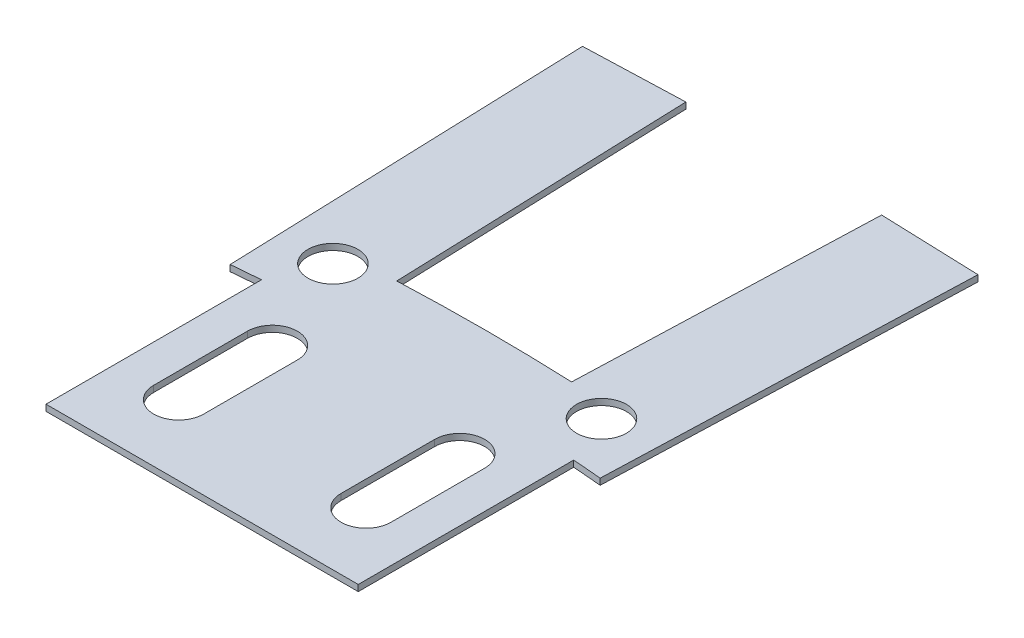
ISO-10303-21;
HEADER;
FILE_DESCRIPTION(('STEP AP214'),'2;1');
FILE_NAME('part.step','',(''),(''),'','','');
FILE_SCHEMA(('AUTOMOTIVE_DESIGN { 1 0 10303 214 1 1 1 1 }'));
ENDSEC;
DATA;
#1=APPLICATION_CONTEXT('core data for automotive mechanical design processes');
#2=APPLICATION_PROTOCOL_DEFINITION('international standard','automotive_design',2000,#1);
#3=PRODUCT_CONTEXT('',#1,'mechanical');
#4=PRODUCT('Part','Part','',(#3));
#5=PRODUCT_RELATED_PRODUCT_CATEGORY('part','',(#4));
#6=PRODUCT_DEFINITION_FORMATION('','',#4);
#7=PRODUCT_DEFINITION_CONTEXT('part definition',#1,'design');
#8=PRODUCT_DEFINITION('design','',#6,#7);
#9=PRODUCT_DEFINITION_SHAPE('','',#8);
#10=(LENGTH_UNIT() NAMED_UNIT(*) SI_UNIT(.MILLI.,.METRE.));
#11=(NAMED_UNIT(*) PLANE_ANGLE_UNIT() SI_UNIT($,.RADIAN.));
#12=(NAMED_UNIT(*) SI_UNIT($,.STERADIAN.) SOLID_ANGLE_UNIT());
#13=UNCERTAINTY_MEASURE_WITH_UNIT(LENGTH_MEASURE(1.E-05),#10,'distance_accuracy_value','');
#14=(GEOMETRIC_REPRESENTATION_CONTEXT(3) GLOBAL_UNCERTAINTY_ASSIGNED_CONTEXT((#13)) GLOBAL_UNIT_ASSIGNED_CONTEXT((#10,
#11,#12)) REPRESENTATION_CONTEXT('',''));
#15=CARTESIAN_POINT('',(0.,0.,0.));
#16=DIRECTION('',(0.,0.,1.));
#17=DIRECTION('',(1.,0.,0.));
#18=AXIS2_PLACEMENT_3D('',#15,#16,#17);
#19=CARTESIAN_POINT('',(0.,0.5,0.));
#20=DIRECTION('',(0.,-1.,0.));
#21=DIRECTION('',(0.,0.,-1.));
#22=AXIS2_PLACEMENT_3D('',#19,#20,#21);
#23=PLANE('',#22);
#24=CARTESIAN_POINT('',(21.4999999999977,0.5,-333.754934474164));
#25=DIRECTION('',(0.,1.,0.));
#26=DIRECTION('',(0.,0.,-1.));
#27=AXIS2_PLACEMENT_3D('',#24,#25,#26);
#28=CIRCLE('',#27,4.00000000000001);
#29=CARTESIAN_POINT('',(21.4999999999977,0.5,-337.754934474164));
#30=VERTEX_POINT('',#29);
#31=EDGE_CURVE('E209',#30,#30,#28,.T.);
#32=ORIENTED_EDGE('',*,*,#31,.F.);
#33=EDGE_LOOP('',(#32));
#34=FACE_BOUND('',#33,.T.);
#35=CARTESIAN_POINT('',(-21.5,0.5,-333.754934474164));
#36=DIRECTION('',(0.,1.,0.));
#37=DIRECTION('',(0.,0.,1.));
#38=AXIS2_PLACEMENT_3D('',#35,#36,#37);
#39=CIRCLE('',#38,4.);
#40=CARTESIAN_POINT('',(-21.5,0.5,-329.754934474164));
#41=VERTEX_POINT('',#40);
#42=EDGE_CURVE('E215',#41,#41,#39,.T.);
#43=ORIENTED_EDGE('',*,*,#42,.F.);
#44=EDGE_LOOP('',(#43));
#45=FACE_BOUND('',#44,.T.);
#46=CARTESIAN_POINT('',(15.,0.5,-302.554578987644));
#47=DIRECTION('',(0.,1.,0.));
#48=DIRECTION('',(0.,0.,-1.));
#49=AXIS2_PLACEMENT_3D('',#46,#47,#48);
#50=CIRCLE('',#49,4.);
#51=CARTESIAN_POINT('',(11.,0.5,-302.554578987644));
#52=VERTEX_POINT('',#51);
#53=CARTESIAN_POINT('',(19.,0.5,-302.554578987644));
#54=VERTEX_POINT('',#53);
#55=EDGE_CURVE('E221',#52,#54,#50,.T.);
#56=ORIENTED_EDGE('',*,*,#55,.F.);
#57=DIRECTION('',(0.,0.,1.));
#58=VECTOR('',#57,1.);
#59=CARTESIAN_POINT('',(11.,0.5,-317.554578987644));
#60=LINE('',#59,#58);
#61=CARTESIAN_POINT('',(11.,0.5,-317.554578987644));
#62=VERTEX_POINT('',#61);
#63=EDGE_CURVE('E229',#62,#52,#60,.T.);
#64=ORIENTED_EDGE('',*,*,#63,.F.);
#65=CARTESIAN_POINT('',(15.,0.5,-317.554578987644));
#66=DIRECTION('',(0.,1.,0.));
#67=DIRECTION('',(0.,0.,-1.));
#68=AXIS2_PLACEMENT_3D('',#65,#66,#67);
#69=CIRCLE('',#68,4.);
#70=CARTESIAN_POINT('',(19.,0.5,-317.554578987644));
#71=VERTEX_POINT('',#70);
#72=EDGE_CURVE('E226',#71,#62,#69,.T.);
#73=ORIENTED_EDGE('',*,*,#72,.F.);
#74=DIRECTION('',(0.,0.,-1.));
#75=VECTOR('',#74,1.);
#76=CARTESIAN_POINT('',(19.,0.5,-317.554578987644));
#77=LINE('',#76,#75);
#78=EDGE_CURVE('E223',#54,#71,#77,.T.);
#79=ORIENTED_EDGE('',*,*,#78,.F.);
#80=EDGE_LOOP('',(#56,#64,#73,#79));
#81=FACE_BOUND('',#80,.T.);
#82=CARTESIAN_POINT('',(0.,0.5,0.));
#83=DIRECTION('',(0.,-1.,0.));
#84=DIRECTION('',(0.,0.,-1.));
#85=AXIS2_PLACEMENT_3D('',#82,#83,#84);
#86=CIRCLE('',#85,326.762335175454);
#87=CARTESIAN_POINT('',(25.,0.5,-325.804578987644));
#88=VERTEX_POINT('',#87);
#89=CARTESIAN_POINT('',(29.6237225761773,0.5,-325.416746265532));
#90=VERTEX_POINT('',#89);
#91=EDGE_CURVE('E252',#88,#90,#86,.T.);
#92=ORIENTED_EDGE('',*,*,#91,.T.);
#93=DIRECTION('',(0.0348994967025015,0.,-0.999390827019096));
#94=VECTOR('',#93,1.);
#95=CARTESIAN_POINT('',(29.6237225761773,0.5,-325.416746265532));
#96=LINE('',#95,#94);
#97=CARTESIAN_POINT('',(31.6654290740256,0.5,-383.883570667289));
#98=VERTEX_POINT('',#97);
#99=EDGE_CURVE('E255',#90,#98,#96,.T.);
#100=ORIENTED_EDGE('',*,*,#99,.T.);
#101=DIRECTION('',(-0.999390827019096,0.,-0.0348994967025035));
#102=VECTOR('',#101,1.);
#103=CARTESIAN_POINT('',(31.6654290740256,0.5,-383.883570667289));
#104=LINE('',#103,#102);
#105=CARTESIAN_POINT('',(15.67517584172,0.5,-384.441962614529));
#106=VERTEX_POINT('',#105);
#107=EDGE_CURVE('E258',#98,#106,#104,.T.);
#108=ORIENTED_EDGE('',*,*,#107,.T.);
#109=DIRECTION('',(-0.0348994967025009,0.,0.999390827019096));
#110=VECTOR('',#109,1.);
#111=CARTESIAN_POINT('',(15.67517584172,0.5,-384.441962614529));
#112=LINE('',#111,#110);
#113=CARTESIAN_POINT('',(14.,0.5,-336.471202917612));
#114=VERTEX_POINT('',#113);
#115=EDGE_CURVE('E260',#106,#114,#112,.T.);
#116=ORIENTED_EDGE('',*,*,#115,.T.);
#117=CARTESIAN_POINT('',(0.,0.5,0.));
#118=DIRECTION('',(0.,1.,0.));
#119=DIRECTION('',(0.,0.,1.));
#120=AXIS2_PLACEMENT_3D('',#117,#118,#119);
#121=CIRCLE('',#120,336.762335175454);
#122=CARTESIAN_POINT('',(-14.,0.5,-336.471202917612));
#123=VERTEX_POINT('',#122);
#124=EDGE_CURVE('E262',#114,#123,#121,.T.);
#125=ORIENTED_EDGE('',*,*,#124,.T.);
#126=DIRECTION('',(-0.0348994967025009,0.,-0.999390827019096));
#127=VECTOR('',#126,1.);
#128=CARTESIAN_POINT('',(-15.67517584172,0.5,-384.441962614529));
#129=LINE('',#128,#127);
#130=CARTESIAN_POINT('',(-15.67517584172,0.5,-384.441962614529));
#131=VERTEX_POINT('',#130);
#132=EDGE_CURVE('E264',#123,#131,#129,.T.);
#133=ORIENTED_EDGE('',*,*,#132,.T.);
#134=DIRECTION('',(-0.999390827019096,0.,0.0348994967025035));
#135=VECTOR('',#134,1.);
#136=CARTESIAN_POINT('',(-31.6654290740256,0.5,-383.883570667289));
#137=LINE('',#136,#135);
#138=CARTESIAN_POINT('',(-31.6654290740256,0.5,-383.883570667289));
#139=VERTEX_POINT('',#138);
#140=EDGE_CURVE('E266',#131,#139,#137,.T.);
#141=ORIENTED_EDGE('',*,*,#140,.T.);
#142=DIRECTION('',(0.0348994967025012,0.,0.999390827019096));
#143=VECTOR('',#142,1.);
#144=CARTESIAN_POINT('',(-29.9934069470303,0.5,-336.003121544011));
#145=LINE('',#144,#143);
#146=CARTESIAN_POINT('',(-29.6237225761773,0.5,-325.416746265532));
#147=VERTEX_POINT('',#146);
#148=EDGE_CURVE('E268',#139,#147,#145,.T.);
#149=ORIENTED_EDGE('',*,*,#148,.T.);
#150=CARTESIAN_POINT('',(0.,0.5,0.));
#151=DIRECTION('',(0.,-1.,0.));
#152=DIRECTION('',(0.,0.,1.));
#153=AXIS2_PLACEMENT_3D('',#150,#151,#152);
#154=CIRCLE('',#153,326.762335175454);
#155=CARTESIAN_POINT('',(-24.9999999999999,0.5,-325.804578987644));
#156=VERTEX_POINT('',#155);
#157=EDGE_CURVE('E270',#147,#156,#154,.T.);
#158=ORIENTED_EDGE('',*,*,#157,.T.);
#159=DIRECTION('',(0.,0.,1.));
#160=VECTOR('',#159,1.);
#161=CARTESIAN_POINT('',(-25.,0.5,-325.804578987644));
#162=LINE('',#161,#160);
#163=CARTESIAN_POINT('',(-25.,0.5,-291.304578987644));
#164=VERTEX_POINT('',#163);
#165=EDGE_CURVE('E272',#156,#164,#162,.T.);
#166=ORIENTED_EDGE('',*,*,#165,.T.);
#167=DIRECTION('',(1.,0.,0.));
#168=VECTOR('',#167,1.);
#169=CARTESIAN_POINT('',(25.,0.5,-291.304578987644));
#170=LINE('',#169,#168);
#171=CARTESIAN_POINT('',(25.,0.5,-291.304578987644));
#172=VERTEX_POINT('',#171);
#173=EDGE_CURVE('E274',#164,#172,#170,.T.);
#174=ORIENTED_EDGE('',*,*,#173,.T.);
#175=DIRECTION('',(0.,0.,-1.));
#176=VECTOR('',#175,1.);
#177=CARTESIAN_POINT('',(25.,0.5,-325.804578987644));
#178=LINE('',#177,#176);
#179=EDGE_CURVE('E276',#172,#88,#178,.T.);
#180=ORIENTED_EDGE('',*,*,#179,.T.);
#181=EDGE_LOOP('',(#92,#100,#108,#116,#125,#133,#141,#149,#158,#166,#174,#180));
#182=FACE_BOUND('',#181,.T.);
#183=CARTESIAN_POINT('',(-15.,0.5,-317.554578987644));
#184=DIRECTION('',(0.,1.,0.));
#185=DIRECTION('',(0.,0.,1.));
#186=AXIS2_PLACEMENT_3D('',#183,#184,#185);
#187=CIRCLE('',#186,4.);
#188=CARTESIAN_POINT('',(-11.,0.5,-317.554578987644));
#189=VERTEX_POINT('',#188);
#190=CARTESIAN_POINT('',(-19.,0.5,-317.554578987644));
#191=VERTEX_POINT('',#190);
#192=EDGE_CURVE('E173',#189,#191,#187,.T.);
#193=ORIENTED_EDGE('',*,*,#192,.F.);
#194=DIRECTION('',(0.,0.,-1.));
#195=VECTOR('',#194,1.);
#196=CARTESIAN_POINT('',(-11.,0.5,-317.554578987644));
#197=LINE('',#196,#195);
#198=CARTESIAN_POINT('',(-11.,0.5,-302.554578987644));
#199=VERTEX_POINT('',#198);
#200=EDGE_CURVE('E195',#199,#189,#197,.T.);
#201=ORIENTED_EDGE('',*,*,#200,.F.);
#202=CARTESIAN_POINT('',(-15.,0.5,-302.554578987644));
#203=DIRECTION('',(0.,1.,0.));
#204=DIRECTION('',(0.,0.,1.));
#205=AXIS2_PLACEMENT_3D('',#202,#203,#204);
#206=CIRCLE('',#205,4.);
#207=CARTESIAN_POINT('',(-19.,0.5,-302.554578987644));
#208=VERTEX_POINT('',#207);
#209=EDGE_CURVE('E193',#208,#199,#206,.T.);
#210=ORIENTED_EDGE('',*,*,#209,.F.);
#211=DIRECTION('',(0.,0.,1.));
#212=VECTOR('',#211,1.);
#213=CARTESIAN_POINT('',(-19.,0.5,-317.554578987644));
#214=LINE('',#213,#212);
#215=EDGE_CURVE('E181',#191,#208,#214,.T.);
#216=ORIENTED_EDGE('',*,*,#215,.F.);
#217=EDGE_LOOP('',(#193,#201,#210,#216));
#218=FACE_BOUND('',#217,.T.);
#219=ADVANCED_FACE('F36',(#34,#45,#81,#182,#218),#23,.F.);
#220=CARTESIAN_POINT('',(0.,-0.5,0.));
#221=DIRECTION('',(0.,-1.,0.));
#222=DIRECTION('',(0.,0.,-1.));
#223=AXIS2_PLACEMENT_3D('',#220,#221,#222);
#224=PLANE('',#223);
#225=CARTESIAN_POINT('',(-21.5,-0.5,-333.754934474164));
#226=DIRECTION('',(0.,1.,0.));
#227=DIRECTION('',(0.,0.,1.));
#228=AXIS2_PLACEMENT_3D('',#225,#226,#227);
#229=CIRCLE('',#228,4.);
#230=CARTESIAN_POINT('',(-21.5,-0.5,-329.754934474164));
#231=VERTEX_POINT('',#230);
#232=EDGE_CURVE('E212',#231,#231,#229,.T.);
#233=ORIENTED_EDGE('',*,*,#232,.T.);
#234=EDGE_LOOP('',(#233));
#235=FACE_BOUND('',#234,.T.);
#236=CARTESIAN_POINT('',(0.,-0.5,0.));
#237=DIRECTION('',(0.,-1.,0.));
#238=DIRECTION('',(0.,0.,-1.));
#239=AXIS2_PLACEMENT_3D('',#236,#237,#238);
#240=CIRCLE('',#239,326.762335175454);
#241=CARTESIAN_POINT('',(25.,-0.5,-325.804578987644));
#242=VERTEX_POINT('',#241);
#243=CARTESIAN_POINT('',(29.6237225761773,-0.5,-325.416746265532));
#244=VERTEX_POINT('',#243);
#245=EDGE_CURVE('E251',#242,#244,#240,.T.);
#246=ORIENTED_EDGE('',*,*,#245,.F.);
#247=DIRECTION('',(0.,0.,-1.));
#248=VECTOR('',#247,1.);
#249=CARTESIAN_POINT('',(25.,-0.5,-325.804578987644));
#250=LINE('',#249,#248);
#251=CARTESIAN_POINT('',(25.,-0.5,-291.304578987644));
#252=VERTEX_POINT('',#251);
#253=EDGE_CURVE('E256',#252,#242,#250,.T.);
#254=ORIENTED_EDGE('',*,*,#253,.F.);
#255=DIRECTION('',(1.,0.,0.));
#256=VECTOR('',#255,1.);
#257=CARTESIAN_POINT('',(25.,-0.5,-291.304578987644));
#258=LINE('',#257,#256);
#259=CARTESIAN_POINT('',(-25.,-0.5,-291.304578987644));
#260=VERTEX_POINT('',#259);
#261=EDGE_CURVE('E300',#260,#252,#258,.T.);
#262=ORIENTED_EDGE('',*,*,#261,.F.);
#263=DIRECTION('',(0.,0.,1.));
#264=VECTOR('',#263,1.);
#265=CARTESIAN_POINT('',(-25.,-0.5,-325.804578987644));
#266=LINE('',#265,#264);
#267=CARTESIAN_POINT('',(-24.9999999999999,-0.5,-325.804578987644));
#268=VERTEX_POINT('',#267);
#269=EDGE_CURVE('E298',#268,#260,#266,.T.);
#270=ORIENTED_EDGE('',*,*,#269,.F.);
#271=CARTESIAN_POINT('',(0.,-0.5,0.));
#272=DIRECTION('',(0.,-1.,0.));
#273=DIRECTION('',(0.,0.,1.));
#274=AXIS2_PLACEMENT_3D('',#271,#272,#273);
#275=CIRCLE('',#274,326.762335175454);
#276=CARTESIAN_POINT('',(-29.6237225761773,-0.5,-325.416746265532));
#277=VERTEX_POINT('',#276);
#278=EDGE_CURVE('E296',#277,#268,#275,.T.);
#279=ORIENTED_EDGE('',*,*,#278,.F.);
#280=DIRECTION('',(0.0348994967025015,0.,0.999390827019096));
#281=VECTOR('',#280,1.);
#282=CARTESIAN_POINT('',(-29.6237225761773,-0.5,-325.416746265532));
#283=LINE('',#282,#281);
#284=CARTESIAN_POINT('',(-31.6654290740256,-0.5,-383.883570667289));
#285=VERTEX_POINT('',#284);
#286=EDGE_CURVE('E294',#285,#277,#283,.T.);
#287=ORIENTED_EDGE('',*,*,#286,.F.);
#288=DIRECTION('',(-0.999390827019096,0.,0.0348994967025035));
#289=VECTOR('',#288,1.);
#290=CARTESIAN_POINT('',(-31.6654290740256,-0.5,-383.883570667289));
#291=LINE('',#290,#289);
#292=CARTESIAN_POINT('',(-15.67517584172,-0.5,-384.441962614529));
#293=VERTEX_POINT('',#292);
#294=EDGE_CURVE('E291',#293,#285,#291,.T.);
#295=ORIENTED_EDGE('',*,*,#294,.F.);
#296=DIRECTION('',(-0.0348994967025009,0.,-0.999390827019096));
#297=VECTOR('',#296,1.);
#298=CARTESIAN_POINT('',(-15.67517584172,-0.5,-384.441962614529));
#299=LINE('',#298,#297);
#300=CARTESIAN_POINT('',(-14.,-0.5,-336.471202917612));
#301=VERTEX_POINT('',#300);
#302=EDGE_CURVE('E289',#301,#293,#299,.T.);
#303=ORIENTED_EDGE('',*,*,#302,.F.);
#304=CARTESIAN_POINT('',(0.,-0.5,0.));
#305=DIRECTION('',(0.,1.,0.));
#306=DIRECTION('',(0.,0.,1.));
#307=AXIS2_PLACEMENT_3D('',#304,#305,#306);
#308=CIRCLE('',#307,336.762335175454);
#309=CARTESIAN_POINT('',(14.,-0.5,-336.471202917612));
#310=VERTEX_POINT('',#309);
#311=EDGE_CURVE('E287',#310,#301,#308,.T.);
#312=ORIENTED_EDGE('',*,*,#311,.F.);
#313=DIRECTION('',(-0.0348994967025009,0.,0.999390827019096));
#314=VECTOR('',#313,1.);
#315=CARTESIAN_POINT('',(15.67517584172,-0.5,-384.441962614529));
#316=LINE('',#315,#314);
#317=CARTESIAN_POINT('',(15.67517584172,-0.5,-384.441962614529));
#318=VERTEX_POINT('',#317);
#319=EDGE_CURVE('E285',#318,#310,#316,.T.);
#320=ORIENTED_EDGE('',*,*,#319,.F.);
#321=DIRECTION('',(-0.999390827019096,0.,-0.0348994967025035));
#322=VECTOR('',#321,1.);
#323=CARTESIAN_POINT('',(31.6654290740256,-0.5,-383.883570667289));
#324=LINE('',#323,#322);
#325=CARTESIAN_POINT('',(31.6654290740256,-0.5,-383.883570667289));
#326=VERTEX_POINT('',#325);
#327=EDGE_CURVE('E283',#326,#318,#324,.T.);
#328=ORIENTED_EDGE('',*,*,#327,.F.);
#329=DIRECTION('',(0.034899496702501,0.,-0.999390827019096));
#330=VECTOR('',#329,1.);
#331=CARTESIAN_POINT('',(29.9934069470303,-0.5,-336.003121544011));
#332=LINE('',#331,#330);
#333=EDGE_CURVE('E281',#244,#326,#332,.T.);
#334=ORIENTED_EDGE('',*,*,#333,.F.);
#335=EDGE_LOOP('',(#246,#254,#262,#270,#279,#287,#295,#303,#312,#320,#328,#334));
#336=FACE_BOUND('',#335,.T.);
#337=DIRECTION('',(0.,0.,1.));
#338=VECTOR('',#337,1.);
#339=CARTESIAN_POINT('',(11.,-0.5,-317.554578987644));
#340=LINE('',#339,#338);
#341=CARTESIAN_POINT('',(11.,-0.5,-317.554578987644));
#342=VERTEX_POINT('',#341);
#343=CARTESIAN_POINT('',(11.,-0.5,-302.554578987644));
#344=VERTEX_POINT('',#343);
#345=EDGE_CURVE('E224',#342,#344,#340,.T.);
#346=ORIENTED_EDGE('',*,*,#345,.T.);
#347=CARTESIAN_POINT('',(15.,-0.5,-302.554578987644));
#348=DIRECTION('',(0.,1.,0.));
#349=DIRECTION('',(0.,0.,-1.));
#350=AXIS2_PLACEMENT_3D('',#347,#348,#349);
#351=CIRCLE('',#350,4.);
#352=CARTESIAN_POINT('',(19.,-0.5,-302.554578987644));
#353=VERTEX_POINT('',#352);
#354=EDGE_CURVE('E218',#344,#353,#351,.T.);
#355=ORIENTED_EDGE('',*,*,#354,.T.);
#356=DIRECTION('',(0.,0.,-1.));
#357=VECTOR('',#356,1.);
#358=CARTESIAN_POINT('',(19.,-0.5,-317.554578987644));
#359=LINE('',#358,#357);
#360=CARTESIAN_POINT('',(19.,-0.5,-317.554578987644));
#361=VERTEX_POINT('',#360);
#362=EDGE_CURVE('E234',#353,#361,#359,.T.);
#363=ORIENTED_EDGE('',*,*,#362,.T.);
#364=CARTESIAN_POINT('',(15.,-0.5,-317.554578987644));
#365=DIRECTION('',(0.,1.,0.));
#366=DIRECTION('',(0.,0.,-1.));
#367=AXIS2_PLACEMENT_3D('',#364,#365,#366);
#368=CIRCLE('',#367,4.);
#369=EDGE_CURVE('E237',#361,#342,#368,.T.);
#370=ORIENTED_EDGE('',*,*,#369,.T.);
#371=EDGE_LOOP('',(#346,#355,#363,#370));
#372=FACE_BOUND('',#371,.T.);
#373=CARTESIAN_POINT('',(21.4999999999977,-0.5,-333.754934474164));
#374=DIRECTION('',(0.,1.,0.));
#375=DIRECTION('',(0.,0.,-1.));
#376=AXIS2_PLACEMENT_3D('',#373,#374,#375);
#377=CIRCLE('',#376,4.00000000000001);
#378=CARTESIAN_POINT('',(21.4999999999977,-0.5,-337.754934474164));
#379=VERTEX_POINT('',#378);
#380=EDGE_CURVE('E189',#379,#379,#377,.T.);
#381=ORIENTED_EDGE('',*,*,#380,.T.);
#382=EDGE_LOOP('',(#381));
#383=FACE_BOUND('',#382,.T.);
#384=DIRECTION('',(0.,0.,-1.));
#385=VECTOR('',#384,1.);
#386=CARTESIAN_POINT('',(-11.,-0.5,-317.554578987644));
#387=LINE('',#386,#385);
#388=CARTESIAN_POINT('',(-11.,-0.5,-302.554578987644));
#389=VERTEX_POINT('',#388);
#390=CARTESIAN_POINT('',(-11.,-0.5,-317.554578987644));
#391=VERTEX_POINT('',#390);
#392=EDGE_CURVE('E182',#389,#391,#387,.T.);
#393=ORIENTED_EDGE('',*,*,#392,.T.);
#394=CARTESIAN_POINT('',(-15.,-0.5,-317.554578987644));
#395=DIRECTION('',(0.,1.,0.));
#396=DIRECTION('',(0.,0.,1.));
#397=AXIS2_PLACEMENT_3D('',#394,#395,#396);
#398=CIRCLE('',#397,4.);
#399=CARTESIAN_POINT('',(-19.,-0.5,-317.554578987644));
#400=VERTEX_POINT('',#399);
#401=EDGE_CURVE('E59',#391,#400,#398,.T.);
#402=ORIENTED_EDGE('',*,*,#401,.T.);
#403=DIRECTION('',(0.,0.,1.));
#404=VECTOR('',#403,1.);
#405=CARTESIAN_POINT('',(-19.,-0.5,-317.554578987644));
#406=LINE('',#405,#404);
#407=CARTESIAN_POINT('',(-19.,-0.5,-302.554578987644));
#408=VERTEX_POINT('',#407);
#409=EDGE_CURVE('E188',#400,#408,#406,.T.);
#410=ORIENTED_EDGE('',*,*,#409,.T.);
#411=CARTESIAN_POINT('',(-15.,-0.5,-302.554578987644));
#412=DIRECTION('',(0.,1.,0.));
#413=DIRECTION('',(0.,0.,1.));
#414=AXIS2_PLACEMENT_3D('',#411,#412,#413);
#415=CIRCLE('',#414,4.);
#416=EDGE_CURVE('E201',#408,#389,#415,.T.);
#417=ORIENTED_EDGE('',*,*,#416,.T.);
#418=EDGE_LOOP('',(#393,#402,#410,#417));
#419=FACE_BOUND('',#418,.T.);
#420=ADVANCED_FACE('F342',(#235,#336,#372,#383,#419),#224,.T.);
#421=CARTESIAN_POINT('',(0.,0.5,0.));
#422=DIRECTION('',(0.,-1.,0.));
#423=DIRECTION('',(0.,0.,-1.));
#424=AXIS2_PLACEMENT_3D('',#421,#422,#423);
#425=CYLINDRICAL_SURFACE('',#424,326.762335175454);
#426=ORIENTED_EDGE('',*,*,#245,.T.);
#427=DIRECTION('',(0.,-1.,0.));
#428=VECTOR('',#427,1.);
#429=CARTESIAN_POINT('',(29.6237225761773,0.5,-325.416746265532));
#430=LINE('',#429,#428);
#431=EDGE_CURVE('E11',#90,#244,#430,.T.);
#432=ORIENTED_EDGE('',*,*,#431,.F.);
#433=ORIENTED_EDGE('',*,*,#91,.F.);
#434=DIRECTION('',(0.,-1.,0.));
#435=VECTOR('',#434,1.);
#436=CARTESIAN_POINT('',(25.,0.5,-325.804578987644));
#437=LINE('',#436,#435);
#438=EDGE_CURVE('E278',#88,#242,#437,.T.);
#439=ORIENTED_EDGE('',*,*,#438,.T.);
#440=EDGE_LOOP('',(#426,#432,#433,#439));
#441=FACE_BOUND('',#440,.T.);
#442=ADVANCED_FACE('F38',(#441),#425,.F.);
#443=CARTESIAN_POINT('',(29.9934069470303,0.5,-336.003121544011));
#444=DIRECTION('',(-0.999390827019096,0.,-0.034899496702501));
#445=DIRECTION('',(-0.034899496702501,0.,0.999390827019096));
#446=AXIS2_PLACEMENT_3D('',#443,#444,#445);
#447=PLANE('',#446);
#448=ORIENTED_EDGE('',*,*,#333,.T.);
#449=DIRECTION('',(0.,-1.,0.));
#450=VECTOR('',#449,1.);
#451=CARTESIAN_POINT('',(31.6654290740256,0.5,-383.883570667289));
#452=LINE('',#451,#450);
#453=EDGE_CURVE('E44',#98,#326,#452,.T.);
#454=ORIENTED_EDGE('',*,*,#453,.F.);
#455=ORIENTED_EDGE('',*,*,#99,.F.);
#456=ORIENTED_EDGE('',*,*,#431,.T.);
#457=EDGE_LOOP('',(#448,#454,#455,#456));
#458=FACE_BOUND('',#457,.T.);
#459=ADVANCED_FACE('F359',(#458),#447,.F.);
#460=CARTESIAN_POINT('',(31.6654290740256,0.5,-383.883570667289));
#461=DIRECTION('',(-0.0348994967025035,0.,0.999390827019096));
#462=DIRECTION('',(0.999390827019096,0.,0.0348994967025035));
#463=AXIS2_PLACEMENT_3D('',#460,#461,#462);
#464=PLANE('',#463);
#465=ORIENTED_EDGE('',*,*,#327,.T.);
#466=DIRECTION('',(0.,-1.,0.));
#467=VECTOR('',#466,1.);
#468=CARTESIAN_POINT('',(15.67517584172,0.5,-384.441962614529));
#469=LINE('',#468,#467);
#470=EDGE_CURVE('E329',#106,#318,#469,.T.);
#471=ORIENTED_EDGE('',*,*,#470,.F.);
#472=ORIENTED_EDGE('',*,*,#107,.F.);
#473=ORIENTED_EDGE('',*,*,#453,.T.);
#474=EDGE_LOOP('',(#465,#471,#472,#473));
#475=FACE_BOUND('',#474,.T.);
#476=ADVANCED_FACE('F336',(#475),#464,.F.);
#477=CARTESIAN_POINT('',(15.67517584172,0.5,-384.441962614529));
#478=DIRECTION('',(0.999390827019096,0.,0.0348994967025009));
#479=DIRECTION('',(0.0348994967025009,0.,-0.999390827019096));
#480=AXIS2_PLACEMENT_3D('',#477,#478,#479);
#481=PLANE('',#480);
#482=ORIENTED_EDGE('',*,*,#319,.T.);
#483=DIRECTION('',(0.,-1.,0.));
#484=VECTOR('',#483,1.);
#485=CARTESIAN_POINT('',(14.,0.5,-336.471202917612));
#486=LINE('',#485,#484);
#487=EDGE_CURVE('E326',#114,#310,#486,.T.);
#488=ORIENTED_EDGE('',*,*,#487,.F.);
#489=ORIENTED_EDGE('',*,*,#115,.F.);
#490=ORIENTED_EDGE('',*,*,#470,.T.);
#491=EDGE_LOOP('',(#482,#488,#489,#490));
#492=FACE_BOUND('',#491,.T.);
#493=ADVANCED_FACE('F348',(#492),#481,.F.);
#494=CARTESIAN_POINT('',(0.,0.5,0.));
#495=DIRECTION('',(0.,-1.,0.));
#496=DIRECTION('',(0.,0.,-1.));
#497=AXIS2_PLACEMENT_3D('',#494,#495,#496);
#498=CYLINDRICAL_SURFACE('',#497,336.762335175454);
#499=ORIENTED_EDGE('',*,*,#311,.T.);
#500=DIRECTION('',(0.,-1.,0.));
#501=VECTOR('',#500,1.);
#502=CARTESIAN_POINT('',(-14.,0.5,-336.471202917612));
#503=LINE('',#502,#501);
#504=EDGE_CURVE('E323',#123,#301,#503,.T.);
#505=ORIENTED_EDGE('',*,*,#504,.F.);
#506=ORIENTED_EDGE('',*,*,#124,.F.);
#507=ORIENTED_EDGE('',*,*,#487,.T.);
#508=EDGE_LOOP('',(#499,#505,#506,#507));
#509=FACE_BOUND('',#508,.T.);
#510=ADVANCED_FACE('F352',(#509),#498,.T.);
#511=CARTESIAN_POINT('',(-15.67517584172,0.5,-384.441962614529));
#512=DIRECTION('',(-0.999390827019096,0.,0.0348994967025009));
#513=DIRECTION('',(0.0348994967025009,0.,0.999390827019096));
#514=AXIS2_PLACEMENT_3D('',#511,#512,#513);
#515=PLANE('',#514);
#516=ORIENTED_EDGE('',*,*,#302,.T.);
#517=DIRECTION('',(0.,-1.,0.));
#518=VECTOR('',#517,1.);
#519=CARTESIAN_POINT('',(-15.67517584172,0.5,-384.441962614529));
#520=LINE('',#519,#518);
#521=EDGE_CURVE('E320',#131,#293,#520,.T.);
#522=ORIENTED_EDGE('',*,*,#521,.F.);
#523=ORIENTED_EDGE('',*,*,#132,.F.);
#524=ORIENTED_EDGE('',*,*,#504,.T.);
#525=EDGE_LOOP('',(#516,#522,#523,#524));
#526=FACE_BOUND('',#525,.T.);
#527=ADVANCED_FACE('F391',(#526),#515,.F.);
#528=CARTESIAN_POINT('',(-31.6654290740256,0.5,-383.883570667289));
#529=DIRECTION('',(0.0348994967025035,0.,0.999390827019096));
#530=DIRECTION('',(0.999390827019096,0.,-0.0348994967025035));
#531=AXIS2_PLACEMENT_3D('',#528,#529,#530);
#532=PLANE('',#531);
#533=ORIENTED_EDGE('',*,*,#294,.T.);
#534=DIRECTION('',(0.,-1.,0.));
#535=VECTOR('',#534,1.);
#536=CARTESIAN_POINT('',(-31.6654290740256,0.5,-383.883570667289));
#537=LINE('',#536,#535);
#538=EDGE_CURVE('E317',#139,#285,#537,.T.);
#539=ORIENTED_EDGE('',*,*,#538,.F.);
#540=ORIENTED_EDGE('',*,*,#140,.F.);
#541=ORIENTED_EDGE('',*,*,#521,.T.);
#542=EDGE_LOOP('',(#533,#539,#540,#541));
#543=FACE_BOUND('',#542,.T.);
#544=ADVANCED_FACE('F389',(#543),#532,.F.);
#545=CARTESIAN_POINT('',(-29.6237225761773,0.5,-325.416746265532));
#546=DIRECTION('',(0.999390827019096,0.,-0.0348994967025015));
#547=DIRECTION('',(-0.0348994967025015,0.,-0.999390827019096));
#548=AXIS2_PLACEMENT_3D('',#545,#546,#547);
#549=PLANE('',#548);
#550=ORIENTED_EDGE('',*,*,#286,.T.);
#551=DIRECTION('',(0.,-1.,0.));
#552=VECTOR('',#551,1.);
#553=CARTESIAN_POINT('',(-29.6237225761773,0.5,-325.416746265532));
#554=LINE('',#553,#552);
#555=EDGE_CURVE('E314',#147,#277,#554,.T.);
#556=ORIENTED_EDGE('',*,*,#555,.F.);
#557=ORIENTED_EDGE('',*,*,#148,.F.);
#558=ORIENTED_EDGE('',*,*,#538,.T.);
#559=EDGE_LOOP('',(#550,#556,#557,#558));
#560=FACE_BOUND('',#559,.T.);
#561=ADVANCED_FACE('F385',(#560),#549,.F.);
#562=CARTESIAN_POINT('',(0.,0.5,0.));
#563=DIRECTION('',(0.,-1.,0.));
#564=DIRECTION('',(0.,0.,-1.));
#565=AXIS2_PLACEMENT_3D('',#562,#563,#564);
#566=CYLINDRICAL_SURFACE('',#565,326.762335175454);
#567=ORIENTED_EDGE('',*,*,#278,.T.);
#568=DIRECTION('',(0.,-1.,0.));
#569=VECTOR('',#568,1.);
#570=CARTESIAN_POINT('',(-24.9999999999999,0.5,-325.804578987644));
#571=LINE('',#570,#569);
#572=EDGE_CURVE('E311',#156,#268,#571,.T.);
#573=ORIENTED_EDGE('',*,*,#572,.F.);
#574=ORIENTED_EDGE('',*,*,#157,.F.);
#575=ORIENTED_EDGE('',*,*,#555,.T.);
#576=EDGE_LOOP('',(#567,#573,#574,#575));
#577=FACE_BOUND('',#576,.T.);
#578=ADVANCED_FACE('F380',(#577),#566,.F.);
#579=CARTESIAN_POINT('',(-25.,0.5,-325.804578987644));
#580=DIRECTION('',(1.,0.,0.));
#581=DIRECTION('',(0.,0.,-1.));
#582=AXIS2_PLACEMENT_3D('',#579,#580,#581);
#583=PLANE('',#582);
#584=ORIENTED_EDGE('',*,*,#269,.T.);
#585=DIRECTION('',(0.,-1.,0.));
#586=VECTOR('',#585,1.);
#587=CARTESIAN_POINT('',(-25.,0.5,-291.304578987644));
#588=LINE('',#587,#586);
#589=EDGE_CURVE('E308',#164,#260,#588,.T.);
#590=ORIENTED_EDGE('',*,*,#589,.F.);
#591=ORIENTED_EDGE('',*,*,#165,.F.);
#592=ORIENTED_EDGE('',*,*,#572,.T.);
#593=EDGE_LOOP('',(#584,#590,#591,#592));
#594=FACE_BOUND('',#593,.T.);
#595=ADVANCED_FACE('F375',(#594),#583,.F.);
#596=CARTESIAN_POINT('',(25.,0.5,-291.304578987644));
#597=DIRECTION('',(0.,0.,-1.));
#598=DIRECTION('',(-1.,0.,0.));
#599=AXIS2_PLACEMENT_3D('',#596,#597,#598);
#600=PLANE('',#599);
#601=ORIENTED_EDGE('',*,*,#261,.T.);
#602=DIRECTION('',(0.,-1.,0.));
#603=VECTOR('',#602,1.);
#604=CARTESIAN_POINT('',(25.,0.5,-291.304578987644));
#605=LINE('',#604,#603);
#606=EDGE_CURVE('E305',#172,#252,#605,.T.);
#607=ORIENTED_EDGE('',*,*,#606,.F.);
#608=ORIENTED_EDGE('',*,*,#173,.F.);
#609=ORIENTED_EDGE('',*,*,#589,.T.);
#610=EDGE_LOOP('',(#601,#607,#608,#609));
#611=FACE_BOUND('',#610,.T.);
#612=ADVANCED_FACE('F371',(#611),#600,.F.);
#613=CARTESIAN_POINT('',(25.,0.5,-325.804578987644));
#614=DIRECTION('',(-1.,0.,0.));
#615=DIRECTION('',(0.,0.,1.));
#616=AXIS2_PLACEMENT_3D('',#613,#614,#615);
#617=PLANE('',#616);
#618=ORIENTED_EDGE('',*,*,#253,.T.);
#619=ORIENTED_EDGE('',*,*,#438,.F.);
#620=ORIENTED_EDGE('',*,*,#179,.F.);
#621=ORIENTED_EDGE('',*,*,#606,.T.);
#622=EDGE_LOOP('',(#618,#619,#620,#621));
#623=FACE_BOUND('',#622,.T.);
#624=ADVANCED_FACE('F366',(#623),#617,.F.);
#625=CARTESIAN_POINT('',(15.,0.5,-302.554578987644));
#626=DIRECTION('',(0.,-1.,0.));
#627=DIRECTION('',(0.,0.,-1.));
#628=AXIS2_PLACEMENT_3D('',#625,#626,#627);
#629=CYLINDRICAL_SURFACE('',#628,4.);
#630=ORIENTED_EDGE('',*,*,#354,.F.);
#631=DIRECTION('',(0.,-1.,0.));
#632=VECTOR('',#631,1.);
#633=CARTESIAN_POINT('',(11.,0.5,-302.554578987644));
#634=LINE('',#633,#632);
#635=EDGE_CURVE('E231',#52,#344,#634,.T.);
#636=ORIENTED_EDGE('',*,*,#635,.F.);
#637=ORIENTED_EDGE('',*,*,#55,.T.);
#638=DIRECTION('',(0.,-1.,0.));
#639=VECTOR('',#638,1.);
#640=CARTESIAN_POINT('',(19.,0.5,-302.554578987644));
#641=LINE('',#640,#639);
#642=EDGE_CURVE('E248',#54,#353,#641,.T.);
#643=ORIENTED_EDGE('',*,*,#642,.T.);
#644=EDGE_LOOP('',(#630,#636,#637,#643));
#645=FACE_BOUND('',#644,.T.);
#646=ADVANCED_FACE('F411',(#645),#629,.F.);
#647=CARTESIAN_POINT('',(19.,0.5,-317.554578987644));
#648=DIRECTION('',(-1.,0.,0.));
#649=DIRECTION('',(0.,0.,1.));
#650=AXIS2_PLACEMENT_3D('',#647,#648,#649);
#651=PLANE('',#650);
#652=ORIENTED_EDGE('',*,*,#362,.F.);
#653=ORIENTED_EDGE('',*,*,#642,.F.);
#654=ORIENTED_EDGE('',*,*,#78,.T.);
#655=DIRECTION('',(0.,-1.,0.));
#656=VECTOR('',#655,1.);
#657=CARTESIAN_POINT('',(19.,0.5,-317.554578987644));
#658=LINE('',#657,#656);
#659=EDGE_CURVE('E246',#71,#361,#658,.T.);
#660=ORIENTED_EDGE('',*,*,#659,.T.);
#661=EDGE_LOOP('',(#652,#653,#654,#660));
#662=FACE_BOUND('',#661,.T.);
#663=ADVANCED_FACE('F449',(#662),#651,.T.);
#664=CARTESIAN_POINT('',(15.,0.5,-317.554578987644));
#665=DIRECTION('',(0.,-1.,0.));
#666=DIRECTION('',(0.,0.,-1.));
#667=AXIS2_PLACEMENT_3D('',#664,#665,#666);
#668=CYLINDRICAL_SURFACE('',#667,4.);
#669=ORIENTED_EDGE('',*,*,#369,.F.);
#670=ORIENTED_EDGE('',*,*,#659,.F.);
#671=ORIENTED_EDGE('',*,*,#72,.T.);
#672=DIRECTION('',(0.,-1.,0.));
#673=VECTOR('',#672,1.);
#674=CARTESIAN_POINT('',(11.,0.5,-317.554578987644));
#675=LINE('',#674,#673);
#676=EDGE_CURVE('E244',#62,#342,#675,.T.);
#677=ORIENTED_EDGE('',*,*,#676,.T.);
#678=EDGE_LOOP('',(#669,#670,#671,#677));
#679=FACE_BOUND('',#678,.T.);
#680=ADVANCED_FACE('F456',(#679),#668,.F.);
#681=CARTESIAN_POINT('',(11.,0.5,-317.554578987644));
#682=DIRECTION('',(1.,0.,0.));
#683=DIRECTION('',(0.,0.,-1.));
#684=AXIS2_PLACEMENT_3D('',#681,#682,#683);
#685=PLANE('',#684);
#686=ORIENTED_EDGE('',*,*,#345,.F.);
#687=ORIENTED_EDGE('',*,*,#676,.F.);
#688=ORIENTED_EDGE('',*,*,#63,.T.);
#689=ORIENTED_EDGE('',*,*,#635,.T.);
#690=EDGE_LOOP('',(#686,#687,#688,#689));
#691=FACE_BOUND('',#690,.T.);
#692=ADVANCED_FACE('F463',(#691),#685,.T.);
#693=CARTESIAN_POINT('',(-21.5,0.5,-333.754934474164));
#694=DIRECTION('',(0.,-1.,0.));
#695=DIRECTION('',(0.,0.,-1.));
#696=AXIS2_PLACEMENT_3D('',#693,#694,#695);
#697=CYLINDRICAL_SURFACE('',#696,4.);
#698=ORIENTED_EDGE('',*,*,#42,.T.);
#699=EDGE_LOOP('',(#698));
#700=FACE_BOUND('',#699,.T.);
#701=ORIENTED_EDGE('',*,*,#232,.F.);
#702=EDGE_LOOP('',(#701));
#703=FACE_BOUND('',#702,.T.);
#704=ADVANCED_FACE('F471',(#700,#703),#697,.F.);
#705=CARTESIAN_POINT('',(21.4999999999977,0.5,-333.754934474164));
#706=DIRECTION('',(0.,-1.,0.));
#707=DIRECTION('',(0.,0.,-1.));
#708=AXIS2_PLACEMENT_3D('',#705,#706,#707);
#709=CYLINDRICAL_SURFACE('',#708,4.00000000000001);
#710=ORIENTED_EDGE('',*,*,#31,.T.);
#711=EDGE_LOOP('',(#710));
#712=FACE_BOUND('',#711,.T.);
#713=ORIENTED_EDGE('',*,*,#380,.F.);
#714=EDGE_LOOP('',(#713));
#715=FACE_BOUND('',#714,.T.);
#716=ADVANCED_FACE('F479',(#712,#715),#709,.F.);
#717=CARTESIAN_POINT('',(-15.,0.5,-317.554578987644));
#718=DIRECTION('',(0.,-1.,0.));
#719=DIRECTION('',(0.,0.,-1.));
#720=AXIS2_PLACEMENT_3D('',#717,#718,#719);
#721=CYLINDRICAL_SURFACE('',#720,4.);
#722=ORIENTED_EDGE('',*,*,#401,.F.);
#723=DIRECTION('',(0.,-1.,0.));
#724=VECTOR('',#723,1.);
#725=CARTESIAN_POINT('',(-11.,0.5,-317.554578987644));
#726=LINE('',#725,#724);
#727=EDGE_CURVE('E177',#189,#391,#726,.T.);
#728=ORIENTED_EDGE('',*,*,#727,.F.);
#729=ORIENTED_EDGE('',*,*,#192,.T.);
#730=DIRECTION('',(0.,-1.,0.));
#731=VECTOR('',#730,1.);
#732=CARTESIAN_POINT('',(-19.,0.5,-317.554578987644));
#733=LINE('',#732,#731);
#734=EDGE_CURVE('E176',#191,#400,#733,.T.);
#735=ORIENTED_EDGE('',*,*,#734,.T.);
#736=EDGE_LOOP('',(#722,#728,#729,#735));
#737=FACE_BOUND('',#736,.T.);
#738=ADVANCED_FACE('F175',(#737),#721,.F.);
#739=CARTESIAN_POINT('',(-19.,0.5,-317.554578987644));
#740=DIRECTION('',(1.,0.,0.));
#741=DIRECTION('',(0.,0.,-1.));
#742=AXIS2_PLACEMENT_3D('',#739,#740,#741);
#743=PLANE('',#742);
#744=ORIENTED_EDGE('',*,*,#409,.F.);
#745=ORIENTED_EDGE('',*,*,#734,.F.);
#746=ORIENTED_EDGE('',*,*,#215,.T.);
#747=DIRECTION('',(0.,-1.,0.));
#748=VECTOR('',#747,1.);
#749=CARTESIAN_POINT('',(-19.,0.5,-302.554578987644));
#750=LINE('',#749,#748);
#751=EDGE_CURVE('E190',#208,#408,#750,.T.);
#752=ORIENTED_EDGE('',*,*,#751,.T.);
#753=EDGE_LOOP('',(#744,#745,#746,#752));
#754=FACE_BOUND('',#753,.T.);
#755=ADVANCED_FACE('F185',(#754),#743,.T.);
#756=CARTESIAN_POINT('',(-15.,0.5,-302.554578987644));
#757=DIRECTION('',(0.,-1.,0.));
#758=DIRECTION('',(0.,0.,-1.));
#759=AXIS2_PLACEMENT_3D('',#756,#757,#758);
#760=CYLINDRICAL_SURFACE('',#759,4.);
#761=ORIENTED_EDGE('',*,*,#416,.F.);
#762=ORIENTED_EDGE('',*,*,#751,.F.);
#763=ORIENTED_EDGE('',*,*,#209,.T.);
#764=DIRECTION('',(0.,-1.,0.));
#765=VECTOR('',#764,1.);
#766=CARTESIAN_POINT('',(-11.,0.5,-302.554578987644));
#767=LINE('',#766,#765);
#768=EDGE_CURVE('E51',#199,#389,#767,.T.);
#769=ORIENTED_EDGE('',*,*,#768,.T.);
#770=EDGE_LOOP('',(#761,#762,#763,#769));
#771=FACE_BOUND('',#770,.T.);
#772=ADVANCED_FACE('F500',(#771),#760,.F.);
#773=CARTESIAN_POINT('',(-11.,0.5,-317.554578987644));
#774=DIRECTION('',(-1.,0.,0.));
#775=DIRECTION('',(0.,0.,1.));
#776=AXIS2_PLACEMENT_3D('',#773,#774,#775);
#777=PLANE('',#776);
#778=ORIENTED_EDGE('',*,*,#392,.F.);
#779=ORIENTED_EDGE('',*,*,#768,.F.);
#780=ORIENTED_EDGE('',*,*,#200,.T.);
#781=ORIENTED_EDGE('',*,*,#727,.T.);
#782=EDGE_LOOP('',(#778,#779,#780,#781));
#783=FACE_BOUND('',#782,.T.);
#784=ADVANCED_FACE('F507',(#783),#777,.T.);
#785=CLOSED_SHELL('',(#219,#420,#442,#459,#476,#493,#510,#527,#544,#561,#578,#595,#612,#624,
#646,#663,#680,#692,#704,#716,#738,#755,#772,#784));
#786=MANIFOLD_SOLID_BREP('B2',#785);
#787=ADVANCED_BREP_SHAPE_REPRESENTATION('',(#18,#786),#14);
#788=SHAPE_DEFINITION_REPRESENTATION(#9,#787);
ENDSEC;
END-ISO-10303-21;
